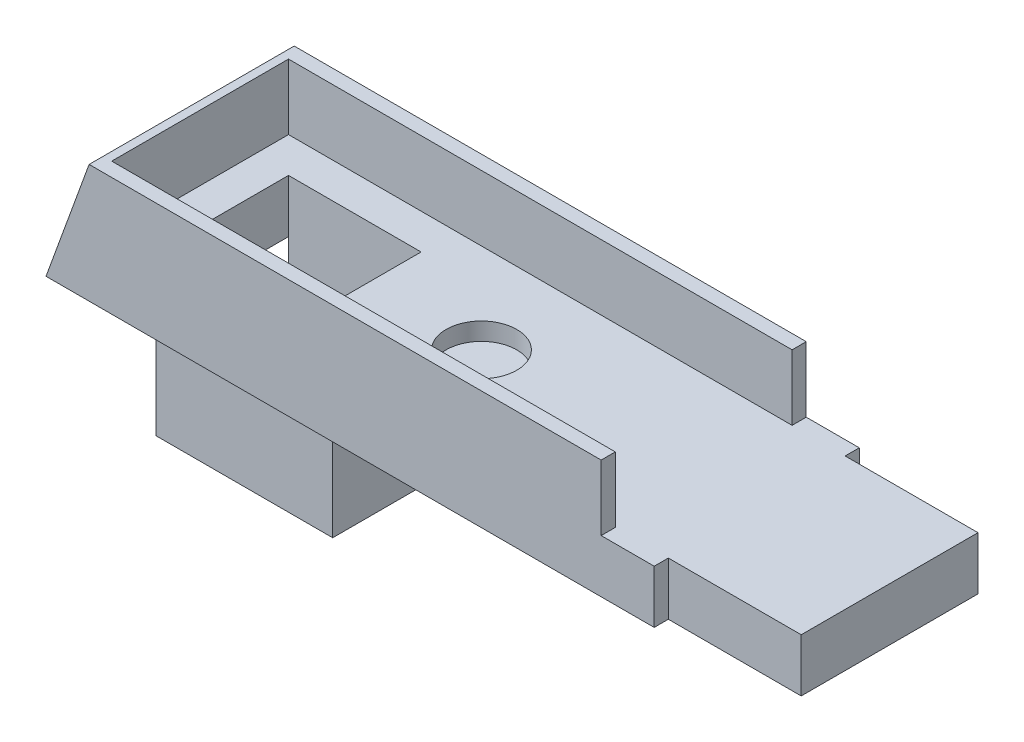
ISO-10303-21;
HEADER;
FILE_DESCRIPTION(('STEP AP214'),'2;1');
FILE_NAME('part.step','',(''),(''),'','','');
FILE_SCHEMA(('AUTOMOTIVE_DESIGN { 1 0 10303 214 1 1 1 1 }'));
ENDSEC;
DATA;
#1=APPLICATION_CONTEXT('core data for automotive mechanical design processes');
#2=APPLICATION_PROTOCOL_DEFINITION('international standard','automotive_design',2000,#1);
#3=PRODUCT_CONTEXT('',#1,'mechanical');
#4=PRODUCT('Part','Part','',(#3));
#5=PRODUCT_RELATED_PRODUCT_CATEGORY('part','',(#4));
#6=PRODUCT_DEFINITION_FORMATION('','',#4);
#7=PRODUCT_DEFINITION_CONTEXT('part definition',#1,'design');
#8=PRODUCT_DEFINITION('design','',#6,#7);
#9=PRODUCT_DEFINITION_SHAPE('','',#8);
#10=(LENGTH_UNIT() NAMED_UNIT(*) SI_UNIT(.MILLI.,.METRE.));
#11=(NAMED_UNIT(*) PLANE_ANGLE_UNIT() SI_UNIT($,.RADIAN.));
#12=(NAMED_UNIT(*) SI_UNIT($,.STERADIAN.) SOLID_ANGLE_UNIT());
#13=UNCERTAINTY_MEASURE_WITH_UNIT(LENGTH_MEASURE(1.E-05),#10,'distance_accuracy_value','');
#14=(GEOMETRIC_REPRESENTATION_CONTEXT(3) GLOBAL_UNCERTAINTY_ASSIGNED_CONTEXT((#13)) GLOBAL_UNIT_ASSIGNED_CONTEXT((#10,
#11,#12)) REPRESENTATION_CONTEXT('',''));
#15=CARTESIAN_POINT('',(0.,0.,0.));
#16=DIRECTION('',(0.,0.,1.));
#17=DIRECTION('',(1.,0.,0.));
#18=AXIS2_PLACEMENT_3D('',#15,#16,#17);
#19=CARTESIAN_POINT('',(0.,3.,0.));
#20=DIRECTION('',(0.,-1.,0.));
#21=DIRECTION('',(0.,0.,-1.));
#22=AXIS2_PLACEMENT_3D('',#19,#20,#21);
#23=PLANE('',#22);
#24=DIRECTION('',(-1.,0.,0.));
#25=VECTOR('',#24,1.);
#26=CARTESIAN_POINT('',(-5.50891078313912,3.,6.39707076400231));
#27=LINE('',#26,#25);
#28=CARTESIAN_POINT('',(-5.50891078313912,3.,6.39707076400231));
#29=VERTEX_POINT('',#28);
#30=CARTESIAN_POINT('',(-13.0089107831391,3.,6.39707076400231));
#31=VERTEX_POINT('',#30);
#32=EDGE_CURVE('E276',#29,#31,#27,.T.);
#33=ORIENTED_EDGE('',*,*,#32,.F.);
#34=DIRECTION('',(0.,0.,-1.));
#35=VECTOR('',#34,1.);
#36=CARTESIAN_POINT('',(-5.50891078313912,3.,12.3970707640023));
#37=LINE('',#36,#35);
#38=CARTESIAN_POINT('',(-5.50891078313912,3.,12.3970707640023));
#39=VERTEX_POINT('',#38);
#40=EDGE_CURVE('E272',#39,#29,#37,.T.);
#41=ORIENTED_EDGE('',*,*,#40,.F.);
#42=DIRECTION('',(1.,0.,0.));
#43=VECTOR('',#42,1.);
#44=CARTESIAN_POINT('',(-13.0089107831391,3.,12.3970707640023));
#45=LINE('',#44,#43);
#46=CARTESIAN_POINT('',(-13.0089107831391,3.,12.3970707640023));
#47=VERTEX_POINT('',#46);
#48=EDGE_CURVE('E279',#47,#39,#45,.T.);
#49=ORIENTED_EDGE('',*,*,#48,.F.);
#50=DIRECTION('',(0.,0.,1.));
#51=VECTOR('',#50,1.);
#52=CARTESIAN_POINT('',(-13.0089107831391,3.,6.39707076400231));
#53=LINE('',#52,#51);
#54=EDGE_CURVE('E282',#31,#47,#53,.T.);
#55=ORIENTED_EDGE('',*,*,#54,.F.);
#56=EDGE_LOOP('',(#33,#41,#49,#55));
#57=FACE_BOUND('',#56,.T.);
#58=CARTESIAN_POINT('',(0.991089216860881,3.,9.48452438115168));
#59=DIRECTION('',(0.,1.,0.));
#60=DIRECTION('',(0.,0.,1.));
#61=AXIS2_PLACEMENT_3D('',#58,#59,#60);
#62=CIRCLE('',#61,2.);
#63=CARTESIAN_POINT('',(0.991089216860881,3.,11.4845243811517));
#64=VERTEX_POINT('',#63);
#65=EDGE_CURVE('E336',#64,#64,#62,.T.);
#66=ORIENTED_EDGE('',*,*,#65,.F.);
#67=EDGE_LOOP('',(#66));
#68=FACE_BOUND('',#67,.T.);
#69=DIRECTION('',(0.,0.,-1.));
#70=VECTOR('',#69,1.);
#71=CARTESIAN_POINT('',(13.4758220502901,3.,3.59707076400231));
#72=LINE('',#71,#70);
#73=CARTESIAN_POINT('',(13.4758220502901,3.,4.39707076400231));
#74=VERTEX_POINT('',#73);
#75=CARTESIAN_POINT('',(13.4758220502901,3.,3.59707076400231));
#76=VERTEX_POINT('',#75);
#77=EDGE_CURVE('E60',#74,#76,#72,.T.);
#78=ORIENTED_EDGE('',*,*,#77,.F.);
#79=DIRECTION('',(1.,0.,0.));
#80=VECTOR('',#79,1.);
#81=CARTESIAN_POINT('',(13.4758220502901,3.,4.39707076400231));
#82=LINE('',#81,#80);
#83=CARTESIAN_POINT('',(-15.0089107831391,3.,4.39707076400231));
#84=VERTEX_POINT('',#83);
#85=EDGE_CURVE('E361',#84,#74,#82,.T.);
#86=ORIENTED_EDGE('',*,*,#85,.F.);
#87=DIRECTION('',(0.,0.,-1.));
#88=VECTOR('',#87,1.);
#89=CARTESIAN_POINT('',(-15.0089107831391,3.,14.3970707640023));
#90=LINE('',#89,#88);
#91=CARTESIAN_POINT('',(-15.0089107831391,3.,14.3970707640023));
#92=VERTEX_POINT('',#91);
#93=EDGE_CURVE('E363',#92,#84,#90,.T.);
#94=ORIENTED_EDGE('',*,*,#93,.F.);
#95=DIRECTION('',(-1.,0.,0.));
#96=VECTOR('',#95,1.);
#97=CARTESIAN_POINT('',(13.4758220502901,3.,14.3970707640023));
#98=LINE('',#97,#96);
#99=CARTESIAN_POINT('',(13.4758220502901,3.,14.3970707640023));
#100=VERTEX_POINT('',#99);
#101=EDGE_CURVE('E366',#100,#92,#98,.T.);
#102=ORIENTED_EDGE('',*,*,#101,.F.);
#103=DIRECTION('',(0.,0.,-1.));
#104=VECTOR('',#103,1.);
#105=CARTESIAN_POINT('',(13.4758220502901,3.,14.3970707640023));
#106=LINE('',#105,#104);
#107=CARTESIAN_POINT('',(13.4758220502901,3.,15.1970707640023));
#108=VERTEX_POINT('',#107);
#109=EDGE_CURVE('E369',#108,#100,#106,.T.);
#110=ORIENTED_EDGE('',*,*,#109,.F.);
#111=DIRECTION('',(1.,0.,0.));
#112=VECTOR('',#111,1.);
#113=CARTESIAN_POINT('',(-16.0089107831391,3.,15.1970707640023));
#114=LINE('',#113,#112);
#115=CARTESIAN_POINT('',(16.4758220502901,3.,15.1970707640023));
#116=VERTEX_POINT('',#115);
#117=EDGE_CURVE('E253',#108,#116,#114,.T.);
#118=ORIENTED_EDGE('',*,*,#117,.T.);
#119=DIRECTION('',(0.,0.,-1.));
#120=VECTOR('',#119,1.);
#121=CARTESIAN_POINT('',(16.4758220502901,3.,15.1970707640023));
#122=LINE('',#121,#120);
#123=CARTESIAN_POINT('',(16.4758220502901,3.,14.3970707640023));
#124=VERTEX_POINT('',#123);
#125=EDGE_CURVE('E225',#116,#124,#122,.T.);
#126=ORIENTED_EDGE('',*,*,#125,.T.);
#127=DIRECTION('',(1.,0.,0.));
#128=VECTOR('',#127,1.);
#129=CARTESIAN_POINT('',(23.9910892168609,3.,14.3970707640023));
#130=LINE('',#129,#128);
#131=CARTESIAN_POINT('',(23.9910892168609,3.,14.3970707640023));
#132=VERTEX_POINT('',#131);
#133=EDGE_CURVE('E215',#124,#132,#130,.T.);
#134=ORIENTED_EDGE('',*,*,#133,.T.);
#135=DIRECTION('',(0.,0.,-1.));
#136=VECTOR('',#135,1.);
#137=CARTESIAN_POINT('',(23.9910892168609,3.,4.39707076400231));
#138=LINE('',#137,#136);
#139=CARTESIAN_POINT('',(23.9910892168609,3.,4.39707076400231));
#140=VERTEX_POINT('',#139);
#141=EDGE_CURVE('E260',#132,#140,#138,.T.);
#142=ORIENTED_EDGE('',*,*,#141,.T.);
#143=DIRECTION('',(-1.,0.,0.));
#144=VECTOR('',#143,1.);
#145=CARTESIAN_POINT('',(16.4758220502901,3.,4.39707076400231));
#146=LINE('',#145,#144);
#147=CARTESIAN_POINT('',(16.4758220502901,3.,4.39707076400231));
#148=VERTEX_POINT('',#147);
#149=EDGE_CURVE('E240',#140,#148,#146,.T.);
#150=ORIENTED_EDGE('',*,*,#149,.T.);
#151=DIRECTION('',(0.,0.,-1.));
#152=VECTOR('',#151,1.);
#153=CARTESIAN_POINT('',(16.4758220502901,3.,3.59707076400231));
#154=LINE('',#153,#152);
#155=CARTESIAN_POINT('',(16.4758220502901,3.,3.59707076400231));
#156=VERTEX_POINT('',#155);
#157=EDGE_CURVE('E257',#148,#156,#154,.T.);
#158=ORIENTED_EDGE('',*,*,#157,.T.);
#159=DIRECTION('',(-1.,0.,0.));
#160=VECTOR('',#159,1.);
#161=CARTESIAN_POINT('',(2.97582205029012,3.,3.59707076400231));
#162=LINE('',#161,#160);
#163=EDGE_CURVE('E255',#156,#76,#162,.T.);
#164=ORIENTED_EDGE('',*,*,#163,.T.);
#165=EDGE_LOOP('',(#78,#86,#94,#102,#110,#118,#126,#134,#142,#150,#158,#164));
#166=FACE_BOUND('',#165,.T.);
#167=ADVANCED_FACE('F37',(#57,#68,#166),#23,.F.);
#168=CARTESIAN_POINT('',(0.,0.,0.));
#169=DIRECTION('',(0.,-1.,0.));
#170=DIRECTION('',(0.,0.,-1.));
#171=AXIS2_PLACEMENT_3D('',#168,#169,#170);
#172=PLANE('',#171);
#173=DIRECTION('',(0.,0.,1.));
#174=VECTOR('',#173,1.);
#175=CARTESIAN_POINT('',(-17.9260642442094,0.,3.19707076400231));
#176=LINE('',#175,#174);
#177=CARTESIAN_POINT('',(-17.9260642442094,0.,3.59707076400231));
#178=VERTEX_POINT('',#177);
#179=CARTESIAN_POINT('',(-17.9260642442094,0.,15.1970707640023));
#180=VERTEX_POINT('',#179);
#181=EDGE_CURVE('E190',#178,#180,#176,.T.);
#182=ORIENTED_EDGE('',*,*,#181,.F.);
#183=DIRECTION('',(-1.,0.,0.));
#184=VECTOR('',#183,1.);
#185=CARTESIAN_POINT('',(-4.02417794970988,0.,3.59707076400231));
#186=LINE('',#185,#184);
#187=CARTESIAN_POINT('',(16.4758220502901,0.,3.59707076400231));
#188=VERTEX_POINT('',#187);
#189=EDGE_CURVE('E213',#188,#178,#186,.T.);
#190=ORIENTED_EDGE('',*,*,#189,.F.);
#191=DIRECTION('',(0.,0.,-1.));
#192=VECTOR('',#191,1.);
#193=CARTESIAN_POINT('',(16.4758220502901,0.,3.59707076400231));
#194=LINE('',#193,#192);
#195=CARTESIAN_POINT('',(16.4758220502901,0.,4.39707076400231));
#196=VERTEX_POINT('',#195);
#197=EDGE_CURVE('E217',#196,#188,#194,.T.);
#198=ORIENTED_EDGE('',*,*,#197,.F.);
#199=DIRECTION('',(-1.,0.,0.));
#200=VECTOR('',#199,1.);
#201=CARTESIAN_POINT('',(16.4758220502901,0.,4.39707076400231));
#202=LINE('',#201,#200);
#203=CARTESIAN_POINT('',(23.9910892168609,0.,4.39707076400231));
#204=VERTEX_POINT('',#203);
#205=EDGE_CURVE('E239',#204,#196,#202,.T.);
#206=ORIENTED_EDGE('',*,*,#205,.F.);
#207=DIRECTION('',(0.,0.,-1.));
#208=VECTOR('',#207,1.);
#209=CARTESIAN_POINT('',(23.9910892168609,0.,4.39707076400231));
#210=LINE('',#209,#208);
#211=CARTESIAN_POINT('',(23.9910892168609,0.,14.3970707640023));
#212=VERTEX_POINT('',#211);
#213=EDGE_CURVE('E243',#212,#204,#210,.T.);
#214=ORIENTED_EDGE('',*,*,#213,.F.);
#215=DIRECTION('',(1.,0.,0.));
#216=VECTOR('',#215,1.);
#217=CARTESIAN_POINT('',(23.9910892168609,0.,14.3970707640023));
#218=LINE('',#217,#216);
#219=CARTESIAN_POINT('',(16.4758220502901,0.,14.3970707640023));
#220=VERTEX_POINT('',#219);
#221=EDGE_CURVE('E246',#220,#212,#218,.T.);
#222=ORIENTED_EDGE('',*,*,#221,.F.);
#223=DIRECTION('',(0.,0.,-1.));
#224=VECTOR('',#223,1.);
#225=CARTESIAN_POINT('',(16.4758220502901,0.,15.1970707640023));
#226=LINE('',#225,#224);
#227=CARTESIAN_POINT('',(16.4758220502901,0.,15.1970707640023));
#228=VERTEX_POINT('',#227);
#229=EDGE_CURVE('E212',#228,#220,#226,.T.);
#230=ORIENTED_EDGE('',*,*,#229,.F.);
#231=DIRECTION('',(1.,0.,0.));
#232=VECTOR('',#231,1.);
#233=CARTESIAN_POINT('',(2.97582205029012,0.,15.1970707640023));
#234=LINE('',#233,#232);
#235=EDGE_CURVE('E203',#180,#228,#234,.T.);
#236=ORIENTED_EDGE('',*,*,#235,.F.);
#237=EDGE_LOOP('',(#182,#190,#198,#206,#214,#222,#230,#236));
#238=FACE_BOUND('',#237,.T.);
#239=DIRECTION('',(0.,0.,-1.));
#240=VECTOR('',#239,1.);
#241=CARTESIAN_POINT('',(-13.0089107831391,0.,12.3970707640023));
#242=LINE('',#241,#240);
#243=CARTESIAN_POINT('',(-13.0089107831391,0.,13.8970707640023));
#244=VERTEX_POINT('',#243);
#245=CARTESIAN_POINT('',(-13.0089107831391,0.,12.3970707640023));
#246=VERTEX_POINT('',#245);
#247=EDGE_CURVE('E303',#244,#246,#242,.T.);
#248=ORIENTED_EDGE('',*,*,#247,.F.);
#249=DIRECTION('',(-1.,0.,0.));
#250=VECTOR('',#249,1.);
#251=CARTESIAN_POINT('',(-13.0089107831391,0.,13.8970707640023));
#252=LINE('',#251,#250);
#253=CARTESIAN_POINT('',(-3.00891078313912,0.,13.8970707640023));
#254=VERTEX_POINT('',#253);
#255=EDGE_CURVE('E307',#254,#244,#252,.T.);
#256=ORIENTED_EDGE('',*,*,#255,.F.);
#257=DIRECTION('',(0.,0.,1.));
#258=VECTOR('',#257,1.);
#259=CARTESIAN_POINT('',(-3.00891078313912,0.,13.8970707640023));
#260=LINE('',#259,#258);
#261=CARTESIAN_POINT('',(-3.00891078313912,0.,4.89707076400231));
#262=VERTEX_POINT('',#261);
#263=EDGE_CURVE('E310',#262,#254,#260,.T.);
#264=ORIENTED_EDGE('',*,*,#263,.F.);
#265=DIRECTION('',(1.,0.,0.));
#266=VECTOR('',#265,1.);
#267=CARTESIAN_POINT('',(-3.00891078313912,0.,4.89707076400231));
#268=LINE('',#267,#266);
#269=CARTESIAN_POINT('',(-13.0089107831391,0.,4.8970707640023));
#270=VERTEX_POINT('',#269);
#271=EDGE_CURVE('E313',#270,#262,#268,.T.);
#272=ORIENTED_EDGE('',*,*,#271,.F.);
#273=DIRECTION('',(0.,0.,-1.));
#274=VECTOR('',#273,1.);
#275=CARTESIAN_POINT('',(-13.0089107831391,0.,4.8970707640023));
#276=LINE('',#275,#274);
#277=CARTESIAN_POINT('',(-13.0089107831391,0.,6.39707076400231));
#278=VERTEX_POINT('',#277);
#279=EDGE_CURVE('E316',#278,#270,#276,.T.);
#280=ORIENTED_EDGE('',*,*,#279,.F.);
#281=DIRECTION('',(0.,0.,1.));
#282=VECTOR('',#281,1.);
#283=CARTESIAN_POINT('',(-13.0089107831391,0.,6.39707076400231));
#284=LINE('',#283,#282);
#285=EDGE_CURVE('E273',#278,#246,#284,.T.);
#286=ORIENTED_EDGE('',*,*,#285,.T.);
#287=EDGE_LOOP('',(#248,#256,#264,#272,#280,#286));
#288=FACE_BOUND('',#287,.T.);
#289=ADVANCED_FACE('F209',(#238,#288),#172,.T.);
#290=CARTESIAN_POINT('',(23.9910892168609,3.,14.3970707640023));
#291=DIRECTION('',(0.,0.,-1.));
#292=DIRECTION('',(-1.,0.,0.));
#293=AXIS2_PLACEMENT_3D('',#290,#291,#292);
#294=PLANE('',#293);
#295=ORIENTED_EDGE('',*,*,#221,.T.);
#296=DIRECTION('',(0.,-1.,0.));
#297=VECTOR('',#296,1.);
#298=CARTESIAN_POINT('',(23.9910892168609,3.,14.3970707640023));
#299=LINE('',#298,#297);
#300=EDGE_CURVE('E11',#132,#212,#299,.T.);
#301=ORIENTED_EDGE('',*,*,#300,.F.);
#302=ORIENTED_EDGE('',*,*,#133,.F.);
#303=DIRECTION('',(0.,-1.,0.));
#304=VECTOR('',#303,1.);
#305=CARTESIAN_POINT('',(16.4758220502901,3.,14.3970707640023));
#306=LINE('',#305,#304);
#307=EDGE_CURVE('E221',#124,#220,#306,.T.);
#308=ORIENTED_EDGE('',*,*,#307,.T.);
#309=EDGE_LOOP('',(#295,#301,#302,#308));
#310=FACE_BOUND('',#309,.T.);
#311=ADVANCED_FACE('F39',(#310),#294,.F.);
#312=CARTESIAN_POINT('',(23.9910892168609,3.,4.39707076400231));
#313=DIRECTION('',(-1.,0.,0.));
#314=DIRECTION('',(0.,0.,1.));
#315=AXIS2_PLACEMENT_3D('',#312,#313,#314);
#316=PLANE('',#315);
#317=ORIENTED_EDGE('',*,*,#213,.T.);
#318=DIRECTION('',(0.,-1.,0.));
#319=VECTOR('',#318,1.);
#320=CARTESIAN_POINT('',(23.9910892168609,3.,4.39707076400231));
#321=LINE('',#320,#319);
#322=EDGE_CURVE('E45',#140,#204,#321,.T.);
#323=ORIENTED_EDGE('',*,*,#322,.F.);
#324=ORIENTED_EDGE('',*,*,#141,.F.);
#325=ORIENTED_EDGE('',*,*,#300,.T.);
#326=EDGE_LOOP('',(#317,#323,#324,#325));
#327=FACE_BOUND('',#326,.T.);
#328=ADVANCED_FACE('F398',(#327),#316,.F.);
#329=CARTESIAN_POINT('',(16.4758220502901,3.,4.39707076400231));
#330=DIRECTION('',(0.,0.,1.));
#331=DIRECTION('',(1.,0.,0.));
#332=AXIS2_PLACEMENT_3D('',#329,#330,#331);
#333=PLANE('',#332);
#334=ORIENTED_EDGE('',*,*,#205,.T.);
#335=DIRECTION('',(0.,-1.,0.));
#336=VECTOR('',#335,1.);
#337=CARTESIAN_POINT('',(16.4758220502901,3.,4.39707076400231));
#338=LINE('',#337,#336);
#339=EDGE_CURVE('E230',#148,#196,#338,.T.);
#340=ORIENTED_EDGE('',*,*,#339,.F.);
#341=ORIENTED_EDGE('',*,*,#149,.F.);
#342=ORIENTED_EDGE('',*,*,#322,.T.);
#343=EDGE_LOOP('',(#334,#340,#341,#342));
#344=FACE_BOUND('',#343,.T.);
#345=ADVANCED_FACE('F237',(#344),#333,.F.);
#346=CARTESIAN_POINT('',(16.4758220502901,3.,3.59707076400231));
#347=DIRECTION('',(-1.,0.,0.));
#348=DIRECTION('',(0.,0.,1.));
#349=AXIS2_PLACEMENT_3D('',#346,#347,#348);
#350=PLANE('',#349);
#351=ORIENTED_EDGE('',*,*,#197,.T.);
#352=DIRECTION('',(0.,-1.,0.));
#353=VECTOR('',#352,1.);
#354=CARTESIAN_POINT('',(16.4758220502901,3.,3.59707076400231));
#355=LINE('',#354,#353);
#356=EDGE_CURVE('E227',#156,#188,#355,.T.);
#357=ORIENTED_EDGE('',*,*,#356,.F.);
#358=ORIENTED_EDGE('',*,*,#157,.F.);
#359=ORIENTED_EDGE('',*,*,#339,.T.);
#360=EDGE_LOOP('',(#351,#357,#358,#359));
#361=FACE_BOUND('',#360,.T.);
#362=ADVANCED_FACE('F394',(#361),#350,.F.);
#363=CARTESIAN_POINT('',(-4.02417794970988,3.,3.59707076400231));
#364=DIRECTION('',(0.,0.,1.));
#365=DIRECTION('',(1.,0.,0.));
#366=AXIS2_PLACEMENT_3D('',#363,#364,#365);
#367=PLANE('',#366);
#368=ORIENTED_EDGE('',*,*,#189,.T.);
#369=DIRECTION('',(0.342020143325663,0.939692620785911,0.));
#370=VECTOR('',#369,1.);
#371=CARTESIAN_POINT('',(-15.3356710548165,7.11704679536612,3.59707076400231));
#372=LINE('',#371,#370);
#373=CARTESIAN_POINT('',(-15.4874636746259,6.7,3.59707076400231));
#374=VERTEX_POINT('',#373);
#375=EDGE_CURVE('E193',#178,#374,#372,.T.);
#376=ORIENTED_EDGE('',*,*,#375,.T.);
#377=DIRECTION('',(-1.,0.,0.));
#378=VECTOR('',#377,1.);
#379=CARTESIAN_POINT('',(-16.0089107831391,6.7,3.59707076400231));
#380=LINE('',#379,#378);
#381=CARTESIAN_POINT('',(13.4758220502901,6.7,3.59707076400231));
#382=VERTEX_POINT('',#381);
#383=EDGE_CURVE('E359',#382,#374,#380,.T.);
#384=ORIENTED_EDGE('',*,*,#383,.F.);
#385=DIRECTION('',(0.,-1.,0.));
#386=VECTOR('',#385,1.);
#387=CARTESIAN_POINT('',(13.4758220502901,6.7,3.59707076400231));
#388=LINE('',#387,#386);
#389=EDGE_CURVE('E356',#382,#76,#388,.T.);
#390=ORIENTED_EDGE('',*,*,#389,.T.);
#391=ORIENTED_EDGE('',*,*,#163,.F.);
#392=ORIENTED_EDGE('',*,*,#356,.T.);
#393=EDGE_LOOP('',(#368,#376,#384,#390,#391,#392));
#394=FACE_BOUND('',#393,.T.);
#395=ADVANCED_FACE('F390',(#394),#367,.F.);
#396=CARTESIAN_POINT('',(2.97582205029012,3.,15.1970707640023));
#397=DIRECTION('',(0.,0.,-1.));
#398=DIRECTION('',(-1.,0.,0.));
#399=AXIS2_PLACEMENT_3D('',#396,#397,#398);
#400=PLANE('',#399);
#401=DIRECTION('',(1.,0.,0.));
#402=VECTOR('',#401,1.);
#403=CARTESIAN_POINT('',(-16.0089107831391,6.7,15.1970707640023));
#404=LINE('',#403,#402);
#405=CARTESIAN_POINT('',(-15.4874636746259,6.7,15.1970707640023));
#406=VERTEX_POINT('',#405);
#407=CARTESIAN_POINT('',(13.4758220502901,6.7,15.1970707640023));
#408=VERTEX_POINT('',#407);
#409=EDGE_CURVE('E206',#406,#408,#404,.T.);
#410=ORIENTED_EDGE('',*,*,#409,.F.);
#411=DIRECTION('',(0.342020143325663,0.939692620785911,0.));
#412=VECTOR('',#411,1.);
#413=CARTESIAN_POINT('',(-17.9260642442094,0.,15.1970707640023));
#414=LINE('',#413,#412);
#415=EDGE_CURVE('E52',#180,#406,#414,.T.);
#416=ORIENTED_EDGE('',*,*,#415,.F.);
#417=ORIENTED_EDGE('',*,*,#235,.T.);
#418=DIRECTION('',(0.,-1.,0.));
#419=VECTOR('',#418,1.);
#420=CARTESIAN_POINT('',(16.4758220502901,3.,15.1970707640023));
#421=LINE('',#420,#419);
#422=EDGE_CURVE('E224',#116,#228,#421,.T.);
#423=ORIENTED_EDGE('',*,*,#422,.F.);
#424=ORIENTED_EDGE('',*,*,#117,.F.);
#425=DIRECTION('',(0.,-1.,0.));
#426=VECTOR('',#425,1.);
#427=CARTESIAN_POINT('',(13.4758220502901,6.7,15.1970707640023));
#428=LINE('',#427,#426);
#429=EDGE_CURVE('E339',#408,#108,#428,.T.);
#430=ORIENTED_EDGE('',*,*,#429,.F.);
#431=EDGE_LOOP('',(#410,#416,#417,#423,#424,#430));
#432=FACE_BOUND('',#431,.T.);
#433=ADVANCED_FACE('F201',(#432),#400,.F.);
#434=CARTESIAN_POINT('',(16.4758220502901,3.,15.1970707640023));
#435=DIRECTION('',(-1.,0.,0.));
#436=DIRECTION('',(0.,0.,1.));
#437=AXIS2_PLACEMENT_3D('',#434,#435,#436);
#438=PLANE('',#437);
#439=ORIENTED_EDGE('',*,*,#229,.T.);
#440=ORIENTED_EDGE('',*,*,#307,.F.);
#441=ORIENTED_EDGE('',*,*,#125,.F.);
#442=ORIENTED_EDGE('',*,*,#422,.T.);
#443=EDGE_LOOP('',(#439,#440,#441,#442));
#444=FACE_BOUND('',#443,.T.);
#445=ADVANCED_FACE('F403',(#444),#438,.F.);
#446=CARTESIAN_POINT('',(-5.50891078313912,3.,6.39707076400231));
#447=DIRECTION('',(0.,0.,1.));
#448=DIRECTION('',(1.,0.,0.));
#449=AXIS2_PLACEMENT_3D('',#446,#447,#448);
#450=PLANE('',#449);
#451=DIRECTION('',(0.,-1.,0.));
#452=VECTOR('',#451,1.);
#453=CARTESIAN_POINT('',(-13.0089107831391,3.,6.39707076400231));
#454=LINE('',#453,#452);
#455=EDGE_CURVE('E251',#31,#278,#454,.T.);
#456=ORIENTED_EDGE('',*,*,#455,.T.);
#457=DIRECTION('',(0.,1.,0.));
#458=VECTOR('',#457,1.);
#459=CARTESIAN_POINT('',(-13.0089107831391,-6.,6.39707076400231));
#460=LINE('',#459,#458);
#461=CARTESIAN_POINT('',(-13.0089107831391,-6.,6.39707076400231));
#462=VERTEX_POINT('',#461);
#463=EDGE_CURVE('E277',#462,#278,#460,.T.);
#464=ORIENTED_EDGE('',*,*,#463,.F.);
#465=DIRECTION('',(-1.,0.,0.));
#466=VECTOR('',#465,1.);
#467=CARTESIAN_POINT('',(-13.0089107831391,-6.,6.39707076400231));
#468=LINE('',#467,#466);
#469=CARTESIAN_POINT('',(-5.50891078313912,-6.,6.39707076400231));
#470=VERTEX_POINT('',#469);
#471=EDGE_CURVE('E329',#470,#462,#468,.T.);
#472=ORIENTED_EDGE('',*,*,#471,.F.);
#473=DIRECTION('',(0.,-1.,0.));
#474=VECTOR('',#473,1.);
#475=CARTESIAN_POINT('',(-5.50891078313912,3.,6.39707076400231));
#476=LINE('',#475,#474);
#477=EDGE_CURVE('E270',#29,#470,#476,.T.);
#478=ORIENTED_EDGE('',*,*,#477,.F.);
#479=ORIENTED_EDGE('',*,*,#32,.T.);
#480=EDGE_LOOP('',(#456,#464,#472,#478,#479));
#481=FACE_BOUND('',#480,.T.);
#482=ADVANCED_FACE('F443',(#481),#450,.T.);
#483=CARTESIAN_POINT('',(-13.0089107831391,3.,6.39707076400231));
#484=DIRECTION('',(1.,0.,0.));
#485=DIRECTION('',(0.,0.,-1.));
#486=AXIS2_PLACEMENT_3D('',#483,#484,#485);
#487=PLANE('',#486);
#488=ORIENTED_EDGE('',*,*,#285,.F.);
#489=ORIENTED_EDGE('',*,*,#455,.F.);
#490=ORIENTED_EDGE('',*,*,#54,.T.);
#491=DIRECTION('',(0.,-1.,0.));
#492=VECTOR('',#491,1.);
#493=CARTESIAN_POINT('',(-13.0089107831391,3.,12.3970707640023));
#494=LINE('',#493,#492);
#495=EDGE_CURVE('E266',#47,#246,#494,.T.);
#496=ORIENTED_EDGE('',*,*,#495,.T.);
#497=EDGE_LOOP('',(#488,#489,#490,#496));
#498=FACE_BOUND('',#497,.T.);
#499=ADVANCED_FACE('F638',(#498),#487,.T.);
#500=CARTESIAN_POINT('',(-13.0089107831391,3.,12.3970707640023));
#501=DIRECTION('',(0.,0.,-1.));
#502=DIRECTION('',(-1.,0.,0.));
#503=AXIS2_PLACEMENT_3D('',#500,#501,#502);
#504=PLANE('',#503);
#505=DIRECTION('',(0.,-1.,0.));
#506=VECTOR('',#505,1.);
#507=CARTESIAN_POINT('',(-5.50891078313912,3.,12.3970707640023));
#508=LINE('',#507,#506);
#509=CARTESIAN_POINT('',(-5.50891078313912,-6.,12.3970707640023));
#510=VERTEX_POINT('',#509);
#511=EDGE_CURVE('E268',#39,#510,#508,.T.);
#512=ORIENTED_EDGE('',*,*,#511,.T.);
#513=DIRECTION('',(1.,0.,0.));
#514=VECTOR('',#513,1.);
#515=CARTESIAN_POINT('',(-13.0089107831391,-6.,12.3970707640023));
#516=LINE('',#515,#514);
#517=CARTESIAN_POINT('',(-13.0089107831391,-6.,12.3970707640023));
#518=VERTEX_POINT('',#517);
#519=EDGE_CURVE('E306',#518,#510,#516,.T.);
#520=ORIENTED_EDGE('',*,*,#519,.F.);
#521=DIRECTION('',(0.,1.,0.));
#522=VECTOR('',#521,1.);
#523=CARTESIAN_POINT('',(-13.0089107831391,-6.,12.3970707640023));
#524=LINE('',#523,#522);
#525=EDGE_CURVE('E299',#518,#246,#524,.T.);
#526=ORIENTED_EDGE('',*,*,#525,.T.);
#527=ORIENTED_EDGE('',*,*,#495,.F.);
#528=ORIENTED_EDGE('',*,*,#48,.T.);
#529=EDGE_LOOP('',(#512,#520,#526,#527,#528));
#530=FACE_BOUND('',#529,.T.);
#531=ADVANCED_FACE('F626',(#530),#504,.T.);
#532=CARTESIAN_POINT('',(-5.50891078313912,3.,12.3970707640023));
#533=DIRECTION('',(-1.,0.,0.));
#534=DIRECTION('',(0.,0.,1.));
#535=AXIS2_PLACEMENT_3D('',#532,#533,#534);
#536=PLANE('',#535);
#537=ORIENTED_EDGE('',*,*,#477,.T.);
#538=DIRECTION('',(0.,0.,-1.));
#539=VECTOR('',#538,1.);
#540=CARTESIAN_POINT('',(-5.50891078313912,-6.,12.3970707640023));
#541=LINE('',#540,#539);
#542=EDGE_CURVE('E331',#510,#470,#541,.T.);
#543=ORIENTED_EDGE('',*,*,#542,.F.);
#544=ORIENTED_EDGE('',*,*,#511,.F.);
#545=ORIENTED_EDGE('',*,*,#40,.T.);
#546=EDGE_LOOP('',(#537,#543,#544,#545));
#547=FACE_BOUND('',#546,.T.);
#548=ADVANCED_FACE('F616',(#547),#536,.T.);
#549=CARTESIAN_POINT('',(-13.0089107831391,-6.,4.8970707640023));
#550=DIRECTION('',(1.,0.,0.));
#551=DIRECTION('',(0.,0.,-1.));
#552=AXIS2_PLACEMENT_3D('',#549,#550,#551);
#553=PLANE('',#552);
#554=ORIENTED_EDGE('',*,*,#279,.T.);
#555=DIRECTION('',(0.,1.,0.));
#556=VECTOR('',#555,1.);
#557=CARTESIAN_POINT('',(-13.0089107831391,-6.,4.8970707640023));
#558=LINE('',#557,#556);
#559=CARTESIAN_POINT('',(-13.0089107831391,-6.,4.8970707640023));
#560=VERTEX_POINT('',#559);
#561=EDGE_CURVE('E287',#560,#270,#558,.T.);
#562=ORIENTED_EDGE('',*,*,#561,.F.);
#563=DIRECTION('',(0.,0.,-1.));
#564=VECTOR('',#563,1.);
#565=CARTESIAN_POINT('',(-13.0089107831391,-6.,4.8970707640023));
#566=LINE('',#565,#564);
#567=EDGE_CURVE('E327',#462,#560,#566,.T.);
#568=ORIENTED_EDGE('',*,*,#567,.F.);
#569=ORIENTED_EDGE('',*,*,#463,.T.);
#570=EDGE_LOOP('',(#554,#562,#568,#569));
#571=FACE_BOUND('',#570,.T.);
#572=ADVANCED_FACE('F607',(#571),#553,.F.);
#573=CARTESIAN_POINT('',(-3.00891078313912,-6.,4.89707076400231));
#574=DIRECTION('',(0.,0.,1.));
#575=DIRECTION('',(1.,0.,0.));
#576=AXIS2_PLACEMENT_3D('',#573,#574,#575);
#577=PLANE('',#576);
#578=ORIENTED_EDGE('',*,*,#271,.T.);
#579=DIRECTION('',(0.,1.,0.));
#580=VECTOR('',#579,1.);
#581=CARTESIAN_POINT('',(-3.00891078313912,-6.,4.89707076400231));
#582=LINE('',#581,#580);
#583=CARTESIAN_POINT('',(-3.00891078313912,-6.,4.89707076400231));
#584=VERTEX_POINT('',#583);
#585=EDGE_CURVE('E290',#584,#262,#582,.T.);
#586=ORIENTED_EDGE('',*,*,#585,.F.);
#587=DIRECTION('',(1.,0.,0.));
#588=VECTOR('',#587,1.);
#589=CARTESIAN_POINT('',(-3.00891078313912,-6.,4.89707076400231));
#590=LINE('',#589,#588);
#591=EDGE_CURVE('E325',#560,#584,#590,.T.);
#592=ORIENTED_EDGE('',*,*,#591,.F.);
#593=ORIENTED_EDGE('',*,*,#561,.T.);
#594=EDGE_LOOP('',(#578,#586,#592,#593));
#595=FACE_BOUND('',#594,.T.);
#596=ADVANCED_FACE('F598',(#595),#577,.F.);
#597=CARTESIAN_POINT('',(-3.00891078313912,-6.,13.8970707640023));
#598=DIRECTION('',(-1.,0.,0.));
#599=DIRECTION('',(0.,0.,1.));
#600=AXIS2_PLACEMENT_3D('',#597,#598,#599);
#601=PLANE('',#600);
#602=ORIENTED_EDGE('',*,*,#263,.T.);
#603=DIRECTION('',(0.,1.,0.));
#604=VECTOR('',#603,1.);
#605=CARTESIAN_POINT('',(-3.00891078313912,-6.,13.8970707640023));
#606=LINE('',#605,#604);
#607=CARTESIAN_POINT('',(-3.00891078313912,-6.,13.8970707640023));
#608=VERTEX_POINT('',#607);
#609=EDGE_CURVE('E293',#608,#254,#606,.T.);
#610=ORIENTED_EDGE('',*,*,#609,.F.);
#611=DIRECTION('',(0.,0.,1.));
#612=VECTOR('',#611,1.);
#613=CARTESIAN_POINT('',(-3.00891078313912,-6.,13.8970707640023));
#614=LINE('',#613,#612);
#615=EDGE_CURVE('E323',#584,#608,#614,.T.);
#616=ORIENTED_EDGE('',*,*,#615,.F.);
#617=ORIENTED_EDGE('',*,*,#585,.T.);
#618=EDGE_LOOP('',(#602,#610,#616,#617));
#619=FACE_BOUND('',#618,.T.);
#620=ADVANCED_FACE('F589',(#619),#601,.F.);
#621=CARTESIAN_POINT('',(-13.0089107831391,-6.,13.8970707640023));
#622=DIRECTION('',(0.,0.,-1.));
#623=DIRECTION('',(-1.,0.,0.));
#624=AXIS2_PLACEMENT_3D('',#621,#622,#623);
#625=PLANE('',#624);
#626=ORIENTED_EDGE('',*,*,#255,.T.);
#627=DIRECTION('',(0.,1.,0.));
#628=VECTOR('',#627,1.);
#629=CARTESIAN_POINT('',(-13.0089107831391,-6.,13.8970707640023));
#630=LINE('',#629,#628);
#631=CARTESIAN_POINT('',(-13.0089107831391,-6.,13.8970707640023));
#632=VERTEX_POINT('',#631);
#633=EDGE_CURVE('E296',#632,#244,#630,.T.);
#634=ORIENTED_EDGE('',*,*,#633,.F.);
#635=DIRECTION('',(-1.,0.,0.));
#636=VECTOR('',#635,1.);
#637=CARTESIAN_POINT('',(-13.0089107831391,-6.,13.8970707640023));
#638=LINE('',#637,#636);
#639=EDGE_CURVE('E321',#608,#632,#638,.T.);
#640=ORIENTED_EDGE('',*,*,#639,.F.);
#641=ORIENTED_EDGE('',*,*,#609,.T.);
#642=EDGE_LOOP('',(#626,#634,#640,#641));
#643=FACE_BOUND('',#642,.T.);
#644=ADVANCED_FACE('F580',(#643),#625,.F.);
#645=CARTESIAN_POINT('',(-13.0089107831391,-6.,12.3970707640023));
#646=DIRECTION('',(1.,0.,0.));
#647=DIRECTION('',(0.,0.,-1.));
#648=AXIS2_PLACEMENT_3D('',#645,#646,#647);
#649=PLANE('',#648);
#650=ORIENTED_EDGE('',*,*,#247,.T.);
#651=ORIENTED_EDGE('',*,*,#525,.F.);
#652=DIRECTION('',(0.,0.,-1.));
#653=VECTOR('',#652,1.);
#654=CARTESIAN_POINT('',(-13.0089107831391,-6.,12.3970707640023));
#655=LINE('',#654,#653);
#656=EDGE_CURVE('E302',#632,#518,#655,.T.);
#657=ORIENTED_EDGE('',*,*,#656,.F.);
#658=ORIENTED_EDGE('',*,*,#633,.T.);
#659=EDGE_LOOP('',(#650,#651,#657,#658));
#660=FACE_BOUND('',#659,.T.);
#661=ADVANCED_FACE('F571',(#660),#649,.F.);
#662=CARTESIAN_POINT('',(0.,-6.,0.));
#663=DIRECTION('',(0.,1.,0.));
#664=DIRECTION('',(0.,0.,1.));
#665=AXIS2_PLACEMENT_3D('',#662,#663,#664);
#666=PLANE('',#665);
#667=ORIENTED_EDGE('',*,*,#519,.T.);
#668=ORIENTED_EDGE('',*,*,#542,.T.);
#669=ORIENTED_EDGE('',*,*,#471,.T.);
#670=ORIENTED_EDGE('',*,*,#567,.T.);
#671=ORIENTED_EDGE('',*,*,#591,.T.);
#672=ORIENTED_EDGE('',*,*,#615,.T.);
#673=ORIENTED_EDGE('',*,*,#639,.T.);
#674=ORIENTED_EDGE('',*,*,#656,.T.);
#675=EDGE_LOOP('',(#667,#668,#669,#670,#671,#672,#673,#674));
#676=FACE_BOUND('',#675,.T.);
#677=ADVANCED_FACE('F562',(#676),#666,.F.);
#678=CARTESIAN_POINT('',(0.991089216860881,2.,9.48452438115168));
#679=DIRECTION('',(0.,1.,0.));
#680=DIRECTION('',(0.,0.,1.));
#681=AXIS2_PLACEMENT_3D('',#678,#679,#680);
#682=CYLINDRICAL_SURFACE('',#681,2.);
#683=CARTESIAN_POINT('',(0.991089216860881,2.,9.48452438115168));
#684=DIRECTION('',(0.,1.,0.));
#685=DIRECTION('',(0.,0.,1.));
#686=AXIS2_PLACEMENT_3D('',#683,#684,#685);
#687=CIRCLE('',#686,2.);
#688=CARTESIAN_POINT('',(0.991089216860881,2.,11.4845243811517));
#689=VERTEX_POINT('',#688);
#690=EDGE_CURVE('E319',#689,#689,#687,.T.);
#691=ORIENTED_EDGE('',*,*,#690,.F.);
#692=EDGE_LOOP('',(#691));
#693=FACE_BOUND('',#692,.T.);
#694=ORIENTED_EDGE('',*,*,#65,.T.);
#695=EDGE_LOOP('',(#694));
#696=FACE_BOUND('',#695,.T.);
#697=ADVANCED_FACE('F553',(#693,#696),#682,.F.);
#698=CARTESIAN_POINT('',(0.991089216860881,2.,9.48452438115168));
#699=DIRECTION('',(0.,1.,0.));
#700=DIRECTION('',(0.,0.,1.));
#701=AXIS2_PLACEMENT_3D('',#698,#699,#700);
#702=PLANE('',#701);
#703=ORIENTED_EDGE('',*,*,#690,.T.);
#704=EDGE_LOOP('',(#703));
#705=FACE_BOUND('',#704,.T.);
#706=ADVANCED_FACE('F526',(#705),#702,.T.);
#707=CARTESIAN_POINT('',(13.4758220502901,6.7,14.3970707640023));
#708=DIRECTION('',(-1.,0.,0.));
#709=DIRECTION('',(0.,0.,1.));
#710=AXIS2_PLACEMENT_3D('',#707,#708,#709);
#711=PLANE('',#710);
#712=ORIENTED_EDGE('',*,*,#109,.T.);
#713=DIRECTION('',(0.,-1.,0.));
#714=VECTOR('',#713,1.);
#715=CARTESIAN_POINT('',(13.4758220502901,6.7,14.3970707640023));
#716=LINE('',#715,#714);
#717=CARTESIAN_POINT('',(13.4758220502901,6.7,14.3970707640023));
#718=VERTEX_POINT('',#717);
#719=EDGE_CURVE('E344',#718,#100,#716,.T.);
#720=ORIENTED_EDGE('',*,*,#719,.F.);
#721=DIRECTION('',(0.,0.,-1.));
#722=VECTOR('',#721,1.);
#723=CARTESIAN_POINT('',(13.4758220502901,6.7,14.3970707640023));
#724=LINE('',#723,#722);
#725=EDGE_CURVE('E382',#408,#718,#724,.T.);
#726=ORIENTED_EDGE('',*,*,#725,.F.);
#727=ORIENTED_EDGE('',*,*,#429,.T.);
#728=EDGE_LOOP('',(#712,#720,#726,#727));
#729=FACE_BOUND('',#728,.T.);
#730=ADVANCED_FACE('F407',(#729),#711,.F.);
#731=CARTESIAN_POINT('',(13.4758220502901,6.7,14.3970707640023));
#732=DIRECTION('',(0.,0.,1.));
#733=DIRECTION('',(1.,0.,0.));
#734=AXIS2_PLACEMENT_3D('',#731,#732,#733);
#735=PLANE('',#734);
#736=ORIENTED_EDGE('',*,*,#101,.T.);
#737=DIRECTION('',(0.,-1.,0.));
#738=VECTOR('',#737,1.);
#739=CARTESIAN_POINT('',(-15.0089107831391,6.7,14.3970707640023));
#740=LINE('',#739,#738);
#741=CARTESIAN_POINT('',(-15.0089107831391,6.7,14.3970707640023));
#742=VERTEX_POINT('',#741);
#743=EDGE_CURVE('E347',#742,#92,#740,.T.);
#744=ORIENTED_EDGE('',*,*,#743,.F.);
#745=DIRECTION('',(-1.,0.,0.));
#746=VECTOR('',#745,1.);
#747=CARTESIAN_POINT('',(13.4758220502901,6.7,14.3970707640023));
#748=LINE('',#747,#746);
#749=EDGE_CURVE('E380',#718,#742,#748,.T.);
#750=ORIENTED_EDGE('',*,*,#749,.F.);
#751=ORIENTED_EDGE('',*,*,#719,.T.);
#752=EDGE_LOOP('',(#736,#744,#750,#751));
#753=FACE_BOUND('',#752,.T.);
#754=ADVANCED_FACE('F414',(#753),#735,.F.);
#755=CARTESIAN_POINT('',(-15.0089107831391,6.7,14.3970707640023));
#756=DIRECTION('',(-1.,0.,0.));
#757=DIRECTION('',(0.,0.,1.));
#758=AXIS2_PLACEMENT_3D('',#755,#756,#757);
#759=PLANE('',#758);
#760=ORIENTED_EDGE('',*,*,#93,.T.);
#761=DIRECTION('',(0.,-1.,0.));
#762=VECTOR('',#761,1.);
#763=CARTESIAN_POINT('',(-15.0089107831391,6.7,4.39707076400231));
#764=LINE('',#763,#762);
#765=CARTESIAN_POINT('',(-15.0089107831391,6.7,4.39707076400231));
#766=VERTEX_POINT('',#765);
#767=EDGE_CURVE('E350',#766,#84,#764,.T.);
#768=ORIENTED_EDGE('',*,*,#767,.F.);
#769=DIRECTION('',(0.,0.,-1.));
#770=VECTOR('',#769,1.);
#771=CARTESIAN_POINT('',(-15.0089107831391,6.7,14.3970707640023));
#772=LINE('',#771,#770);
#773=EDGE_CURVE('E378',#742,#766,#772,.T.);
#774=ORIENTED_EDGE('',*,*,#773,.F.);
#775=ORIENTED_EDGE('',*,*,#743,.T.);
#776=EDGE_LOOP('',(#760,#768,#774,#775));
#777=FACE_BOUND('',#776,.T.);
#778=ADVANCED_FACE('F416',(#777),#759,.F.);
#779=CARTESIAN_POINT('',(13.4758220502901,6.7,4.39707076400231));
#780=DIRECTION('',(0.,0.,-1.));
#781=DIRECTION('',(-1.,0.,0.));
#782=AXIS2_PLACEMENT_3D('',#779,#780,#781);
#783=PLANE('',#782);
#784=ORIENTED_EDGE('',*,*,#85,.T.);
#785=DIRECTION('',(0.,-1.,0.));
#786=VECTOR('',#785,1.);
#787=CARTESIAN_POINT('',(13.4758220502901,6.7,4.39707076400231));
#788=LINE('',#787,#786);
#789=CARTESIAN_POINT('',(13.4758220502901,6.7,4.39707076400231));
#790=VERTEX_POINT('',#789);
#791=EDGE_CURVE('E353',#790,#74,#788,.T.);
#792=ORIENTED_EDGE('',*,*,#791,.F.);
#793=DIRECTION('',(1.,0.,0.));
#794=VECTOR('',#793,1.);
#795=CARTESIAN_POINT('',(13.4758220502901,6.7,4.39707076400231));
#796=LINE('',#795,#794);
#797=EDGE_CURVE('E376',#766,#790,#796,.T.);
#798=ORIENTED_EDGE('',*,*,#797,.F.);
#799=ORIENTED_EDGE('',*,*,#767,.T.);
#800=EDGE_LOOP('',(#784,#792,#798,#799));
#801=FACE_BOUND('',#800,.T.);
#802=ADVANCED_FACE('F420',(#801),#783,.F.);
#803=CARTESIAN_POINT('',(13.4758220502901,6.7,3.59707076400231));
#804=DIRECTION('',(-1.,0.,0.));
#805=DIRECTION('',(0.,0.,1.));
#806=AXIS2_PLACEMENT_3D('',#803,#804,#805);
#807=PLANE('',#806);
#808=ORIENTED_EDGE('',*,*,#77,.T.);
#809=ORIENTED_EDGE('',*,*,#389,.F.);
#810=DIRECTION('',(0.,0.,-1.));
#811=VECTOR('',#810,1.);
#812=CARTESIAN_POINT('',(13.4758220502901,6.7,3.59707076400231));
#813=LINE('',#812,#811);
#814=EDGE_CURVE('E374',#790,#382,#813,.T.);
#815=ORIENTED_EDGE('',*,*,#814,.F.);
#816=ORIENTED_EDGE('',*,*,#791,.T.);
#817=EDGE_LOOP('',(#808,#809,#815,#816));
#818=FACE_BOUND('',#817,.T.);
#819=ADVANCED_FACE('F424',(#818),#807,.F.);
#820=CARTESIAN_POINT('',(0.,6.7,0.));
#821=DIRECTION('',(0.,1.,0.));
#822=DIRECTION('',(0.,0.,1.));
#823=AXIS2_PLACEMENT_3D('',#820,#821,#822);
#824=PLANE('',#823);
#825=DIRECTION('',(0.,0.,1.));
#826=VECTOR('',#825,1.);
#827=CARTESIAN_POINT('',(-15.4874636746259,6.7,3.19707076400231));
#828=LINE('',#827,#826);
#829=EDGE_CURVE('E197',#374,#406,#828,.T.);
#830=ORIENTED_EDGE('',*,*,#829,.T.);
#831=ORIENTED_EDGE('',*,*,#409,.T.);
#832=ORIENTED_EDGE('',*,*,#725,.T.);
#833=ORIENTED_EDGE('',*,*,#749,.T.);
#834=ORIENTED_EDGE('',*,*,#773,.T.);
#835=ORIENTED_EDGE('',*,*,#797,.T.);
#836=ORIENTED_EDGE('',*,*,#814,.T.);
#837=ORIENTED_EDGE('',*,*,#383,.T.);
#838=EDGE_LOOP('',(#830,#831,#832,#833,#834,#835,#836,#837));
#839=FACE_BOUND('',#838,.T.);
#840=ADVANCED_FACE('F387',(#839),#824,.T.);
#841=CARTESIAN_POINT('',(-17.9260642442094,0.,3.19707076400231));
#842=DIRECTION('',(0.939692620785911,-0.342020143325663,0.));
#843=DIRECTION('',(0.342020143325663,0.939692620785911,0.));
#844=AXIS2_PLACEMENT_3D('',#841,#842,#843);
#845=PLANE('',#844);
#846=ORIENTED_EDGE('',*,*,#181,.T.);
#847=ORIENTED_EDGE('',*,*,#415,.T.);
#848=ORIENTED_EDGE('',*,*,#829,.F.);
#849=ORIENTED_EDGE('',*,*,#375,.F.);
#850=EDGE_LOOP('',(#846,#847,#848,#849));
#851=FACE_BOUND('',#850,.T.);
#852=ADVANCED_FACE('F191',(#851),#845,.F.);
#853=CLOSED_SHELL('',(#167,#289,#311,#328,#345,#362,#395,#433,#445,#482,#499,#531,#548,#572,
#596,#620,#644,#661,#677,#697,#706,#730,#754,#778,#802,#819,#840,#852));
#854=MANIFOLD_SOLID_BREP('B2',#853);
#855=ADVANCED_BREP_SHAPE_REPRESENTATION('',(#18,#854),#14);
#856=SHAPE_DEFINITION_REPRESENTATION(#9,#855);
ENDSEC;
END-ISO-10303-21;
